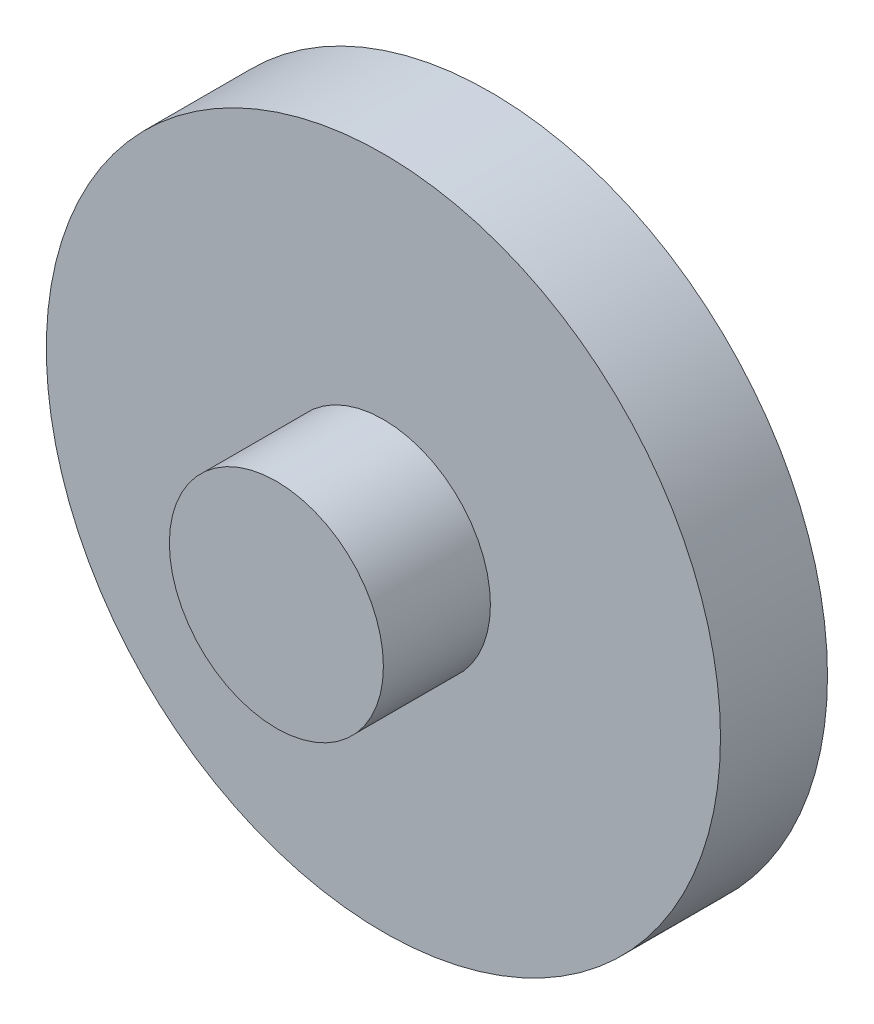
ISO-10303-21;
HEADER;
FILE_DESCRIPTION(('STEP AP214'),'2;1');
FILE_NAME('part.step','',(''),(''),'','','');
FILE_SCHEMA(('AUTOMOTIVE_DESIGN { 1 0 10303 214 1 1 1 1 }'));
ENDSEC;
DATA;
#1=APPLICATION_CONTEXT('core data for automotive mechanical design processes');
#2=APPLICATION_PROTOCOL_DEFINITION('international standard','automotive_design',2000,#1);
#3=PRODUCT_CONTEXT('',#1,'mechanical');
#4=PRODUCT('Part','Part','',(#3));
#5=PRODUCT_RELATED_PRODUCT_CATEGORY('part','',(#4));
#6=PRODUCT_DEFINITION_FORMATION('','',#4);
#7=PRODUCT_DEFINITION_CONTEXT('part definition',#1,'design');
#8=PRODUCT_DEFINITION('design','',#6,#7);
#9=PRODUCT_DEFINITION_SHAPE('','',#8);
#10=(LENGTH_UNIT() NAMED_UNIT(*) SI_UNIT(.MILLI.,.METRE.));
#11=(NAMED_UNIT(*) PLANE_ANGLE_UNIT() SI_UNIT($,.RADIAN.));
#12=(NAMED_UNIT(*) SI_UNIT($,.STERADIAN.) SOLID_ANGLE_UNIT());
#13=UNCERTAINTY_MEASURE_WITH_UNIT(LENGTH_MEASURE(1.E-05),#10,'distance_accuracy_value','');
#14=(GEOMETRIC_REPRESENTATION_CONTEXT(3) GLOBAL_UNCERTAINTY_ASSIGNED_CONTEXT((#13)) GLOBAL_UNIT_ASSIGNED_CONTEXT((#10,
#11,#12)) REPRESENTATION_CONTEXT('',''));
#15=CARTESIAN_POINT('',(0.,0.,0.));
#16=DIRECTION('',(0.,0.,1.));
#17=DIRECTION('',(1.,0.,0.));
#18=AXIS2_PLACEMENT_3D('',#15,#16,#17);
#19=CARTESIAN_POINT('',(0.,0.,5.));
#20=DIRECTION('',(0.,0.,1.));
#21=DIRECTION('',(1.,0.,0.));
#22=AXIS2_PLACEMENT_3D('',#19,#20,#21);
#23=PLANE('',#22);
#24=CARTESIAN_POINT('',(0.,0.,5.));
#25=DIRECTION('',(0.,0.,1.));
#26=DIRECTION('',(1.,0.,0.));
#27=AXIS2_PLACEMENT_3D('',#24,#25,#26);
#28=CIRCLE('',#27,15.75);
#29=CARTESIAN_POINT('',(15.75,0.,5.));
#30=VERTEX_POINT('',#29);
#31=EDGE_CURVE('E10',#30,#30,#28,.T.);
#32=ORIENTED_EDGE('',*,*,#31,.T.);
#33=EDGE_LOOP('',(#32));
#34=FACE_BOUND('',#33,.T.);
#35=CARTESIAN_POINT('',(0.,0.,5.));
#36=DIRECTION('',(0.,0.,1.));
#37=DIRECTION('',(1.,0.,0.));
#38=AXIS2_PLACEMENT_3D('',#35,#36,#37);
#39=CIRCLE('',#38,5.);
#40=CARTESIAN_POINT('',(5.,0.,5.));
#41=VERTEX_POINT('',#40);
#42=EDGE_CURVE('E42',#41,#41,#39,.T.);
#43=ORIENTED_EDGE('',*,*,#42,.F.);
#44=EDGE_LOOP('',(#43));
#45=FACE_BOUND('',#44,.T.);
#46=ADVANCED_FACE('F31',(#34,#45),#23,.T.);
#47=CARTESIAN_POINT('',(0.,0.,0.));
#48=DIRECTION('',(0.,0.,1.));
#49=DIRECTION('',(1.,0.,0.));
#50=AXIS2_PLACEMENT_3D('',#47,#48,#49);
#51=PLANE('',#50);
#52=CARTESIAN_POINT('',(0.,0.,0.));
#53=DIRECTION('',(0.,0.,1.));
#54=DIRECTION('',(1.,0.,0.));
#55=AXIS2_PLACEMENT_3D('',#52,#53,#54);
#56=CIRCLE('',#55,15.75);
#57=CARTESIAN_POINT('',(15.75,0.,0.));
#58=VERTEX_POINT('',#57);
#59=EDGE_CURVE('E35',#58,#58,#56,.T.);
#60=ORIENTED_EDGE('',*,*,#59,.F.);
#61=EDGE_LOOP('',(#60));
#62=FACE_BOUND('',#61,.T.);
#63=ADVANCED_FACE('F61',(#62),#51,.F.);
#64=CARTESIAN_POINT('',(0.,0.,5.));
#65=DIRECTION('',(0.,0.,-1.));
#66=DIRECTION('',(-1.,0.,0.));
#67=AXIS2_PLACEMENT_3D('',#64,#65,#66);
#68=CYLINDRICAL_SURFACE('',#67,15.75);
#69=ORIENTED_EDGE('',*,*,#31,.F.);
#70=EDGE_LOOP('',(#69));
#71=FACE_BOUND('',#70,.T.);
#72=ORIENTED_EDGE('',*,*,#59,.T.);
#73=EDGE_LOOP('',(#72));
#74=FACE_BOUND('',#73,.T.);
#75=ADVANCED_FACE('F33',(#71,#74),#68,.T.);
#76=CARTESIAN_POINT('',(0.,0.,10.));
#77=DIRECTION('',(0.,0.,-1.));
#78=DIRECTION('',(-1.,0.,0.));
#79=AXIS2_PLACEMENT_3D('',#76,#77,#78);
#80=CYLINDRICAL_SURFACE('',#79,5.);
#81=ORIENTED_EDGE('',*,*,#42,.T.);
#82=EDGE_LOOP('',(#81));
#83=FACE_BOUND('',#82,.T.);
#84=CARTESIAN_POINT('',(0.,0.,10.));
#85=DIRECTION('',(0.,0.,1.));
#86=DIRECTION('',(1.,0.,0.));
#87=AXIS2_PLACEMENT_3D('',#84,#85,#86);
#88=CIRCLE('',#87,5.);
#89=CARTESIAN_POINT('',(5.,0.,10.));
#90=VERTEX_POINT('',#89);
#91=EDGE_CURVE('E46',#90,#90,#88,.T.);
#92=ORIENTED_EDGE('',*,*,#91,.F.);
#93=EDGE_LOOP('',(#92));
#94=FACE_BOUND('',#93,.T.);
#95=ADVANCED_FACE('F52',(#83,#94),#80,.T.);
#96=CARTESIAN_POINT('',(0.,0.,10.));
#97=DIRECTION('',(0.,0.,1.));
#98=DIRECTION('',(1.,0.,0.));
#99=AXIS2_PLACEMENT_3D('',#96,#97,#98);
#100=PLANE('',#99);
#101=ORIENTED_EDGE('',*,*,#91,.T.);
#102=EDGE_LOOP('',(#101));
#103=FACE_BOUND('',#102,.T.);
#104=ADVANCED_FACE('F50',(#103),#100,.T.);
#105=CLOSED_SHELL('',(#46,#63,#75,#95,#104));
#106=MANIFOLD_SOLID_BREP('B2',#105);
#107=ADVANCED_BREP_SHAPE_REPRESENTATION('',(#18,#106),#14);
#108=SHAPE_DEFINITION_REPRESENTATION(#9,#107);
ENDSEC;
END-ISO-10303-21;
